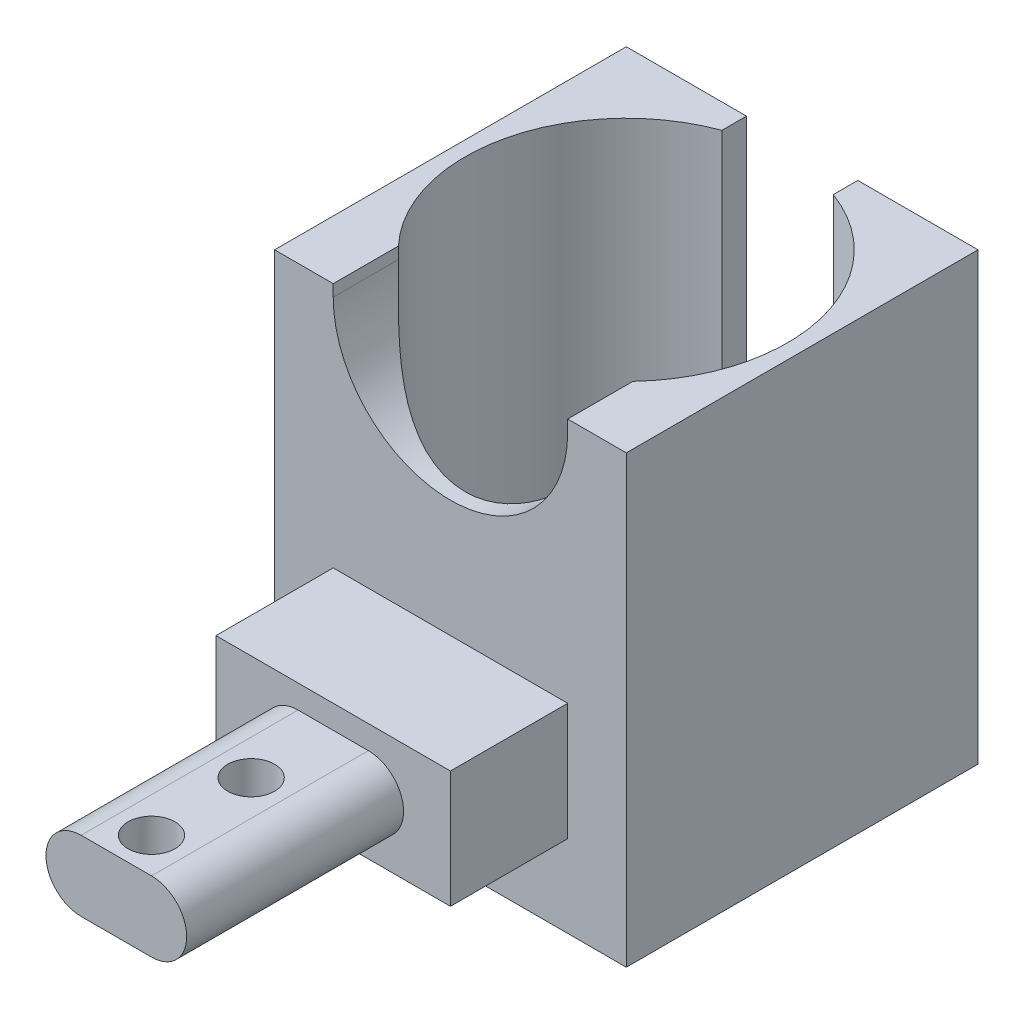
ISO-10303-21;
HEADER;
FILE_DESCRIPTION(('STEP AP214'),'2;1');
FILE_NAME('part.step','',(''),(''),'','','');
FILE_SCHEMA(('AUTOMOTIVE_DESIGN { 1 0 10303 214 1 1 1 1 }'));
ENDSEC;
DATA;
#1=APPLICATION_CONTEXT('core data for automotive mechanical design processes');
#2=APPLICATION_PROTOCOL_DEFINITION('international standard','automotive_design',2000,#1);
#3=PRODUCT_CONTEXT('',#1,'mechanical');
#4=PRODUCT('Part','Part','',(#3));
#5=PRODUCT_RELATED_PRODUCT_CATEGORY('part','',(#4));
#6=PRODUCT_DEFINITION_FORMATION('','',#4);
#7=PRODUCT_DEFINITION_CONTEXT('part definition',#1,'design');
#8=PRODUCT_DEFINITION('design','',#6,#7);
#9=PRODUCT_DEFINITION_SHAPE('','',#8);
#10=(LENGTH_UNIT() NAMED_UNIT(*) SI_UNIT(.MILLI.,.METRE.));
#11=(NAMED_UNIT(*) PLANE_ANGLE_UNIT() SI_UNIT($,.RADIAN.));
#12=(NAMED_UNIT(*) SI_UNIT($,.STERADIAN.) SOLID_ANGLE_UNIT());
#13=UNCERTAINTY_MEASURE_WITH_UNIT(LENGTH_MEASURE(1.E-05),#10,'distance_accuracy_value','');
#14=(GEOMETRIC_REPRESENTATION_CONTEXT(3) GLOBAL_UNCERTAINTY_ASSIGNED_CONTEXT((#13)) GLOBAL_UNIT_ASSIGNED_CONTEXT((#10,
#11,#12)) REPRESENTATION_CONTEXT('',''));
#15=CARTESIAN_POINT('',(0.,0.,0.));
#16=DIRECTION('',(0.,0.,1.));
#17=DIRECTION('',(1.,0.,0.));
#18=AXIS2_PLACEMENT_3D('',#15,#16,#17);
#19=CARTESIAN_POINT('',(-15.,18.,30.));
#20=DIRECTION('',(0.,-1.,0.));
#21=DIRECTION('',(0.,0.,-1.));
#22=AXIS2_PLACEMENT_3D('',#19,#20,#21);
#23=PLANE('',#22);
#24=CARTESIAN_POINT('',(0.,18.,15.));
#25=DIRECTION('',(0.,1.,0.));
#26=DIRECTION('',(0.,0.,1.));
#27=AXIS2_PLACEMENT_3D('',#24,#25,#26);
#28=CIRCLE('',#27,13.75);
#29=CARTESIAN_POINT('',(10.,18.,24.4372930440885));
#30=VERTEX_POINT('',#29);
#31=CARTESIAN_POINT('',(4.75,18.,2.09651209943606));
#32=VERTEX_POINT('',#31);
#33=EDGE_CURVE('E324',#30,#32,#28,.T.);
#34=ORIENTED_EDGE('',*,*,#33,.F.);
#35=DIRECTION('',(0.,0.,-1.));
#36=VECTOR('',#35,1.);
#37=CARTESIAN_POINT('',(10.,18.,-0.001000000000001));
#38=LINE('',#37,#36);
#39=CARTESIAN_POINT('',(10.,18.,30.));
#40=VERTEX_POINT('',#39);
#41=EDGE_CURVE('E243',#40,#30,#38,.T.);
#42=ORIENTED_EDGE('',*,*,#41,.F.);
#43=DIRECTION('',(-1.,0.,0.));
#44=VECTOR('',#43,1.);
#45=CARTESIAN_POINT('',(-15.,18.,30.));
#46=LINE('',#45,#44);
#47=CARTESIAN_POINT('',(15.,18.,30.));
#48=VERTEX_POINT('',#47);
#49=EDGE_CURVE('E289',#48,#40,#46,.T.);
#50=ORIENTED_EDGE('',*,*,#49,.F.);
#51=DIRECTION('',(0.,0.,-1.));
#52=VECTOR('',#51,1.);
#53=CARTESIAN_POINT('',(15.,18.,30.));
#54=LINE('',#53,#52);
#55=CARTESIAN_POINT('',(15.,18.,0.));
#56=VERTEX_POINT('',#55);
#57=EDGE_CURVE('E11',#48,#56,#54,.T.);
#58=ORIENTED_EDGE('',*,*,#57,.T.);
#59=DIRECTION('',(-1.,0.,0.));
#60=VECTOR('',#59,1.);
#61=CARTESIAN_POINT('',(-15.,18.,0.));
#62=LINE('',#61,#60);
#63=CARTESIAN_POINT('',(4.75,18.,0.));
#64=VERTEX_POINT('',#63);
#65=EDGE_CURVE('E182',#56,#64,#62,.T.);
#66=ORIENTED_EDGE('',*,*,#65,.T.);
#67=DIRECTION('',(0.,0.,-1.));
#68=VECTOR('',#67,1.);
#69=CARTESIAN_POINT('',(4.75,18.,58.501));
#70=LINE('',#69,#68);
#71=EDGE_CURVE('E678',#32,#64,#70,.T.);
#72=ORIENTED_EDGE('',*,*,#71,.F.);
#73=EDGE_LOOP('',(#34,#42,#50,#58,#66,#72));
#74=FACE_BOUND('',#73,.T.);
#75=ADVANCED_FACE('F34',(#74),#23,.F.);
#76=CARTESIAN_POINT('',(0.,0.,30.));
#77=DIRECTION('',(0.,0.,1.));
#78=DIRECTION('',(1.,0.,0.));
#79=AXIS2_PLACEMENT_3D('',#76,#77,#78);
#80=PLANE('',#79);
#81=DIRECTION('',(0.,1.,0.));
#82=VECTOR('',#81,1.);
#83=CARTESIAN_POINT('',(10.,17.,30.));
#84=LINE('',#83,#82);
#85=CARTESIAN_POINT('',(10.,17.,30.));
#86=VERTEX_POINT('',#85);
#87=EDGE_CURVE('E227',#86,#40,#84,.T.);
#88=ORIENTED_EDGE('',*,*,#87,.F.);
#89=CARTESIAN_POINT('',(0.,17.,30.));
#90=DIRECTION('',(0.,0.,1.));
#91=DIRECTION('',(1.,0.,0.));
#92=AXIS2_PLACEMENT_3D('',#89,#90,#91);
#93=CIRCLE('',#92,10.);
#94=CARTESIAN_POINT('',(-10.,17.,30.));
#95=VERTEX_POINT('',#94);
#96=EDGE_CURVE('E230',#95,#86,#93,.T.);
#97=ORIENTED_EDGE('',*,*,#96,.F.);
#98=DIRECTION('',(0.,-1.,0.));
#99=VECTOR('',#98,1.);
#100=CARTESIAN_POINT('',(-10.,17.,30.));
#101=LINE('',#100,#99);
#102=CARTESIAN_POINT('',(-10.,18.,30.));
#103=VERTEX_POINT('',#102);
#104=EDGE_CURVE('E222',#103,#95,#101,.T.);
#105=ORIENTED_EDGE('',*,*,#104,.F.);
#106=CARTESIAN_POINT('',(-15.,18.,30.));
#107=VERTEX_POINT('',#106);
#108=EDGE_CURVE('E285',#103,#107,#46,.T.);
#109=ORIENTED_EDGE('',*,*,#108,.T.);
#110=DIRECTION('',(0.,-1.,0.));
#111=VECTOR('',#110,1.);
#112=CARTESIAN_POINT('',(-15.,18.,30.));
#113=LINE('',#112,#111);
#114=CARTESIAN_POINT('',(-15.,-20.,30.));
#115=VERTEX_POINT('',#114);
#116=EDGE_CURVE('E292',#107,#115,#113,.T.);
#117=ORIENTED_EDGE('',*,*,#116,.T.);
#118=DIRECTION('',(-1.,0.,0.));
#119=VECTOR('',#118,1.);
#120=CARTESIAN_POINT('',(15.,-20.,30.));
#121=LINE('',#120,#119);
#122=CARTESIAN_POINT('',(15.,-20.,30.));
#123=VERTEX_POINT('',#122);
#124=EDGE_CURVE('E197',#123,#115,#121,.T.);
#125=ORIENTED_EDGE('',*,*,#124,.F.);
#126=DIRECTION('',(0.,1.,0.));
#127=VECTOR('',#126,1.);
#128=CARTESIAN_POINT('',(15.,18.,30.));
#129=LINE('',#128,#127);
#130=EDGE_CURVE('E181',#123,#48,#129,.T.);
#131=ORIENTED_EDGE('',*,*,#130,.T.);
#132=ORIENTED_EDGE('',*,*,#49,.T.);
#133=EDGE_LOOP('',(#88,#97,#105,#109,#117,#125,#131,#132));
#134=FACE_BOUND('',#133,.T.);
#135=DIRECTION('',(-1.,0.,0.));
#136=VECTOR('',#135,1.);
#137=CARTESIAN_POINT('',(-10.,-3.,30.));
#138=LINE('',#137,#136);
#139=CARTESIAN_POINT('',(10.,-3.,30.));
#140=VERTEX_POINT('',#139);
#141=CARTESIAN_POINT('',(-10.,-3.,30.));
#142=VERTEX_POINT('',#141);
#143=EDGE_CURVE('E376',#140,#142,#138,.T.);
#144=ORIENTED_EDGE('',*,*,#143,.F.);
#145=DIRECTION('',(0.,1.,0.));
#146=VECTOR('',#145,1.);
#147=CARTESIAN_POINT('',(10.,-3.,30.));
#148=LINE('',#147,#146);
#149=CARTESIAN_POINT('',(10.,-13.,30.));
#150=VERTEX_POINT('',#149);
#151=EDGE_CURVE('E362',#150,#140,#148,.T.);
#152=ORIENTED_EDGE('',*,*,#151,.F.);
#153=DIRECTION('',(1.,0.,0.));
#154=VECTOR('',#153,1.);
#155=CARTESIAN_POINT('',(-10.,-13.,30.));
#156=LINE('',#155,#154);
#157=CARTESIAN_POINT('',(-10.,-13.,30.));
#158=VERTEX_POINT('',#157);
#159=EDGE_CURVE('E367',#158,#150,#156,.T.);
#160=ORIENTED_EDGE('',*,*,#159,.F.);
#161=DIRECTION('',(0.,-1.,0.));
#162=VECTOR('',#161,1.);
#163=CARTESIAN_POINT('',(-10.,-3.,30.));
#164=LINE('',#163,#162);
#165=EDGE_CURVE('E378',#142,#158,#164,.T.);
#166=ORIENTED_EDGE('',*,*,#165,.F.);
#167=EDGE_LOOP('',(#144,#152,#160,#166));
#168=FACE_BOUND('',#167,.T.);
#169=ADVANCED_FACE('F266',(#134,#168),#80,.T.);
#170=CARTESIAN_POINT('',(15.,18.,30.));
#171=DIRECTION('',(-1.,0.,0.));
#172=DIRECTION('',(0.,0.,1.));
#173=AXIS2_PLACEMENT_3D('',#170,#171,#172);
#174=PLANE('',#173);
#175=DIRECTION('',(0.,1.,0.));
#176=VECTOR('',#175,1.);
#177=CARTESIAN_POINT('',(15.,18.,0.));
#178=LINE('',#177,#176);
#179=CARTESIAN_POINT('',(15.,-20.,0.));
#180=VERTEX_POINT('',#179);
#181=EDGE_CURVE('E188',#180,#56,#178,.T.);
#182=ORIENTED_EDGE('',*,*,#181,.T.);
#183=ORIENTED_EDGE('',*,*,#57,.F.);
#184=ORIENTED_EDGE('',*,*,#130,.F.);
#185=DIRECTION('',(0.,0.,1.));
#186=VECTOR('',#185,1.);
#187=CARTESIAN_POINT('',(15.,-20.,30.));
#188=LINE('',#187,#186);
#189=EDGE_CURVE('E192',#180,#123,#188,.T.);
#190=ORIENTED_EDGE('',*,*,#189,.F.);
#191=EDGE_LOOP('',(#182,#183,#184,#190));
#192=FACE_BOUND('',#191,.T.);
#193=ADVANCED_FACE('F36',(#192),#174,.F.);
#194=ORIENTED_EDGE('',*,*,#108,.F.);
#195=DIRECTION('',(0.,0.,1.));
#196=VECTOR('',#195,1.);
#197=CARTESIAN_POINT('',(-10.,18.,-0.001000000000001));
#198=LINE('',#197,#196);
#199=CARTESIAN_POINT('',(-10.,18.,24.4372930440884));
#200=VERTEX_POINT('',#199);
#201=EDGE_CURVE('E215',#200,#103,#198,.T.);
#202=ORIENTED_EDGE('',*,*,#201,.F.);
#203=CARTESIAN_POINT('',(-4.75,18.,2.09651209943606));
#204=VERTEX_POINT('',#203);
#205=EDGE_CURVE('E325',#204,#200,#28,.T.);
#206=ORIENTED_EDGE('',*,*,#205,.F.);
#207=DIRECTION('',(0.,0.,1.));
#208=VECTOR('',#207,1.);
#209=CARTESIAN_POINT('',(-4.75,18.,58.501));
#210=LINE('',#209,#208);
#211=CARTESIAN_POINT('',(-4.75,18.,0.));
#212=VERTEX_POINT('',#211);
#213=EDGE_CURVE('E304',#212,#204,#210,.T.);
#214=ORIENTED_EDGE('',*,*,#213,.F.);
#215=CARTESIAN_POINT('',(-15.,18.,0.));
#216=VERTEX_POINT('',#215);
#217=EDGE_CURVE('E299',#212,#216,#62,.T.);
#218=ORIENTED_EDGE('',*,*,#217,.T.);
#219=DIRECTION('',(0.,0.,-1.));
#220=VECTOR('',#219,1.);
#221=CARTESIAN_POINT('',(-15.,18.,30.));
#222=LINE('',#221,#220);
#223=EDGE_CURVE('E42',#107,#216,#222,.T.);
#224=ORIENTED_EDGE('',*,*,#223,.F.);
#225=EDGE_LOOP('',(#194,#202,#206,#214,#218,#224));
#226=FACE_BOUND('',#225,.T.);
#227=ADVANCED_FACE('F268',(#226),#23,.F.);
#228=CARTESIAN_POINT('',(-15.,18.,30.));
#229=DIRECTION('',(1.,0.,0.));
#230=DIRECTION('',(0.,0.,-1.));
#231=AXIS2_PLACEMENT_3D('',#228,#229,#230);
#232=PLANE('',#231);
#233=DIRECTION('',(0.,-1.,0.));
#234=VECTOR('',#233,1.);
#235=CARTESIAN_POINT('',(-15.,18.,0.));
#236=LINE('',#235,#234);
#237=CARTESIAN_POINT('',(-15.,-20.,0.));
#238=VERTEX_POINT('',#237);
#239=EDGE_CURVE('E172',#216,#238,#236,.T.);
#240=ORIENTED_EDGE('',*,*,#239,.T.);
#241=DIRECTION('',(0.,0.,-1.));
#242=VECTOR('',#241,1.);
#243=CARTESIAN_POINT('',(-15.,-20.,30.));
#244=LINE('',#243,#242);
#245=EDGE_CURVE('E177',#115,#238,#244,.T.);
#246=ORIENTED_EDGE('',*,*,#245,.F.);
#247=ORIENTED_EDGE('',*,*,#116,.F.);
#248=ORIENTED_EDGE('',*,*,#223,.T.);
#249=EDGE_LOOP('',(#240,#246,#247,#248));
#250=FACE_BOUND('',#249,.T.);
#251=ADVANCED_FACE('F174',(#250),#232,.F.);
#252=CARTESIAN_POINT('',(0.,0.,0.));
#253=DIRECTION('',(0.,0.,1.));
#254=DIRECTION('',(1.,0.,0.));
#255=AXIS2_PLACEMENT_3D('',#252,#253,#254);
#256=PLANE('',#255);
#257=ORIENTED_EDGE('',*,*,#217,.F.);
#258=DIRECTION('',(0.,1.,0.));
#259=VECTOR('',#258,1.);
#260=CARTESIAN_POINT('',(-4.75,-2.25,0.));
#261=LINE('',#260,#259);
#262=CARTESIAN_POINT('',(-4.75,-2.25,0.));
#263=VERTEX_POINT('',#262);
#264=EDGE_CURVE('E307',#263,#212,#261,.T.);
#265=ORIENTED_EDGE('',*,*,#264,.F.);
#266=CARTESIAN_POINT('',(0.,-2.25,0.));
#267=DIRECTION('',(0.,0.,-1.));
#268=DIRECTION('',(-1.,0.,0.));
#269=AXIS2_PLACEMENT_3D('',#266,#267,#268);
#270=CIRCLE('',#269,4.75);
#271=CARTESIAN_POINT('',(4.75,-2.25,0.));
#272=VERTEX_POINT('',#271);
#273=EDGE_CURVE('E310',#272,#263,#270,.T.);
#274=ORIENTED_EDGE('',*,*,#273,.F.);
#275=DIRECTION('',(0.,-1.,0.));
#276=VECTOR('',#275,1.);
#277=CARTESIAN_POINT('',(4.75,-2.25,0.));
#278=LINE('',#277,#276);
#279=EDGE_CURVE('E311',#64,#272,#278,.T.);
#280=ORIENTED_EDGE('',*,*,#279,.F.);
#281=ORIENTED_EDGE('',*,*,#65,.F.);
#282=ORIENTED_EDGE('',*,*,#181,.F.);
#283=DIRECTION('',(1.,0.,0.));
#284=VECTOR('',#283,1.);
#285=CARTESIAN_POINT('',(15.,-20.,0.));
#286=LINE('',#285,#284);
#287=EDGE_CURVE('E185',#238,#180,#286,.T.);
#288=ORIENTED_EDGE('',*,*,#287,.F.);
#289=ORIENTED_EDGE('',*,*,#239,.F.);
#290=EDGE_LOOP('',(#257,#265,#274,#280,#281,#282,#288,#289));
#291=FACE_BOUND('',#290,.T.);
#292=ADVANCED_FACE('F186',(#291),#256,.F.);
#293=CARTESIAN_POINT('',(10.,-3.,40.));
#294=DIRECTION('',(-1.,0.,0.));
#295=DIRECTION('',(0.,0.,1.));
#296=AXIS2_PLACEMENT_3D('',#293,#294,#295);
#297=PLANE('',#296);
#298=ORIENTED_EDGE('',*,*,#151,.T.);
#299=DIRECTION('',(0.,0.,-1.));
#300=VECTOR('',#299,1.);
#301=CARTESIAN_POINT('',(10.,-3.,40.));
#302=LINE('',#301,#300);
#303=CARTESIAN_POINT('',(10.,-3.,40.));
#304=VERTEX_POINT('',#303);
#305=EDGE_CURVE('E300',#304,#140,#302,.T.);
#306=ORIENTED_EDGE('',*,*,#305,.F.);
#307=DIRECTION('',(0.,1.,0.));
#308=VECTOR('',#307,1.);
#309=CARTESIAN_POINT('',(10.,-3.,40.));
#310=LINE('',#309,#308);
#311=CARTESIAN_POINT('',(10.,-13.,40.));
#312=VERTEX_POINT('',#311);
#313=EDGE_CURVE('E363',#312,#304,#310,.T.);
#314=ORIENTED_EDGE('',*,*,#313,.F.);
#315=DIRECTION('',(0.,0.,-1.));
#316=VECTOR('',#315,1.);
#317=CARTESIAN_POINT('',(10.,-13.,40.));
#318=LINE('',#317,#316);
#319=EDGE_CURVE('E373',#312,#150,#318,.T.);
#320=ORIENTED_EDGE('',*,*,#319,.T.);
#321=EDGE_LOOP('',(#298,#306,#314,#320));
#322=FACE_BOUND('',#321,.T.);
#323=ADVANCED_FACE('F396',(#322),#297,.F.);
#324=CARTESIAN_POINT('',(-10.,-3.,40.));
#325=DIRECTION('',(0.,-1.,0.));
#326=DIRECTION('',(0.,0.,-1.));
#327=AXIS2_PLACEMENT_3D('',#324,#325,#326);
#328=PLANE('',#327);
#329=ORIENTED_EDGE('',*,*,#143,.T.);
#330=DIRECTION('',(0.,0.,-1.));
#331=VECTOR('',#330,1.);
#332=CARTESIAN_POINT('',(-10.,-3.,40.));
#333=LINE('',#332,#331);
#334=CARTESIAN_POINT('',(-10.,-3.,40.));
#335=VERTEX_POINT('',#334);
#336=EDGE_CURVE('E386',#335,#142,#333,.T.);
#337=ORIENTED_EDGE('',*,*,#336,.F.);
#338=DIRECTION('',(-1.,0.,0.));
#339=VECTOR('',#338,1.);
#340=CARTESIAN_POINT('',(-10.,-3.,40.));
#341=LINE('',#340,#339);
#342=EDGE_CURVE('E366',#304,#335,#341,.T.);
#343=ORIENTED_EDGE('',*,*,#342,.F.);
#344=ORIENTED_EDGE('',*,*,#305,.T.);
#345=EDGE_LOOP('',(#329,#337,#343,#344));
#346=FACE_BOUND('',#345,.T.);
#347=ADVANCED_FACE('F390',(#346),#328,.F.);
#348=CARTESIAN_POINT('',(-10.,-3.,40.));
#349=DIRECTION('',(1.,0.,0.));
#350=DIRECTION('',(0.,0.,-1.));
#351=AXIS2_PLACEMENT_3D('',#348,#349,#350);
#352=PLANE('',#351);
#353=ORIENTED_EDGE('',*,*,#165,.T.);
#354=DIRECTION('',(0.,0.,-1.));
#355=VECTOR('',#354,1.);
#356=CARTESIAN_POINT('',(-10.,-13.,40.));
#357=LINE('',#356,#355);
#358=CARTESIAN_POINT('',(-10.,-13.,40.));
#359=VERTEX_POINT('',#358);
#360=EDGE_CURVE('E384',#359,#158,#357,.T.);
#361=ORIENTED_EDGE('',*,*,#360,.F.);
#362=DIRECTION('',(0.,-1.,0.));
#363=VECTOR('',#362,1.);
#364=CARTESIAN_POINT('',(-10.,-3.,40.));
#365=LINE('',#364,#363);
#366=EDGE_CURVE('E369',#335,#359,#365,.T.);
#367=ORIENTED_EDGE('',*,*,#366,.F.);
#368=ORIENTED_EDGE('',*,*,#336,.T.);
#369=EDGE_LOOP('',(#353,#361,#367,#368));
#370=FACE_BOUND('',#369,.T.);
#371=ADVANCED_FACE('F403',(#370),#352,.F.);
#372=CARTESIAN_POINT('',(-10.,-13.,40.));
#373=DIRECTION('',(0.,1.,0.));
#374=DIRECTION('',(0.,0.,1.));
#375=AXIS2_PLACEMENT_3D('',#372,#373,#374);
#376=PLANE('',#375);
#377=ORIENTED_EDGE('',*,*,#159,.T.);
#378=ORIENTED_EDGE('',*,*,#319,.F.);
#379=DIRECTION('',(1.,0.,0.));
#380=VECTOR('',#379,1.);
#381=CARTESIAN_POINT('',(-10.,-13.,40.));
#382=LINE('',#381,#380);
#383=EDGE_CURVE('E371',#359,#312,#382,.T.);
#384=ORIENTED_EDGE('',*,*,#383,.F.);
#385=ORIENTED_EDGE('',*,*,#360,.T.);
#386=EDGE_LOOP('',(#377,#378,#384,#385));
#387=FACE_BOUND('',#386,.T.);
#388=ADVANCED_FACE('F409',(#387),#376,.F.);
#389=CARTESIAN_POINT('',(0.,0.,40.));
#390=DIRECTION('',(0.,0.,1.));
#391=DIRECTION('',(1.,0.,0.));
#392=AXIS2_PLACEMENT_3D('',#389,#390,#391);
#393=PLANE('',#392);
#394=CARTESIAN_POINT('',(-3.,-8.,40.));
#395=DIRECTION('',(0.,0.,1.));
#396=DIRECTION('',(1.,0.,0.));
#397=AXIS2_PLACEMENT_3D('',#394,#395,#396);
#398=CIRCLE('',#397,3.);
#399=CARTESIAN_POINT('',(-3.,-5.,40.));
#400=VERTEX_POINT('',#399);
#401=CARTESIAN_POINT('',(-3.,-11.,40.));
#402=VERTEX_POINT('',#401);
#403=EDGE_CURVE('E327',#400,#402,#398,.T.);
#404=ORIENTED_EDGE('',*,*,#403,.F.);
#405=DIRECTION('',(-1.,0.,0.));
#406=VECTOR('',#405,1.);
#407=CARTESIAN_POINT('',(-3.,-5.,40.));
#408=LINE('',#407,#406);
#409=CARTESIAN_POINT('',(3.,-5.,40.));
#410=VERTEX_POINT('',#409);
#411=EDGE_CURVE('E334',#410,#400,#408,.T.);
#412=ORIENTED_EDGE('',*,*,#411,.F.);
#413=CARTESIAN_POINT('',(3.,-8.,40.));
#414=DIRECTION('',(0.,0.,1.));
#415=DIRECTION('',(1.,0.,0.));
#416=AXIS2_PLACEMENT_3D('',#413,#414,#415);
#417=CIRCLE('',#416,3.);
#418=CARTESIAN_POINT('',(3.,-11.,40.));
#419=VERTEX_POINT('',#418);
#420=EDGE_CURVE('E346',#419,#410,#417,.T.);
#421=ORIENTED_EDGE('',*,*,#420,.F.);
#422=DIRECTION('',(1.,0.,0.));
#423=VECTOR('',#422,1.);
#424=CARTESIAN_POINT('',(-3.,-11.,40.));
#425=LINE('',#424,#423);
#426=EDGE_CURVE('E343',#402,#419,#425,.T.);
#427=ORIENTED_EDGE('',*,*,#426,.F.);
#428=EDGE_LOOP('',(#404,#412,#421,#427));
#429=FACE_BOUND('',#428,.T.);
#430=ORIENTED_EDGE('',*,*,#313,.T.);
#431=ORIENTED_EDGE('',*,*,#342,.T.);
#432=ORIENTED_EDGE('',*,*,#366,.T.);
#433=ORIENTED_EDGE('',*,*,#383,.T.);
#434=EDGE_LOOP('',(#430,#431,#432,#433));
#435=FACE_BOUND('',#434,.T.);
#436=ADVANCED_FACE('F407',(#429,#435),#393,.T.);
#437=CARTESIAN_POINT('',(-3.,-8.,58.5));
#438=DIRECTION('',(0.,0.,-1.));
#439=DIRECTION('',(-1.,0.,0.));
#440=AXIS2_PLACEMENT_3D('',#437,#438,#439);
#441=CYLINDRICAL_SURFACE('',#440,3.);
#442=ORIENTED_EDGE('',*,*,#403,.T.);
#443=DIRECTION('',(0.,0.,-1.));
#444=VECTOR('',#443,1.);
#445=CARTESIAN_POINT('',(-3.,-11.,58.5));
#446=LINE('',#445,#444);
#447=CARTESIAN_POINT('',(-3.,-11.,58.5));
#448=VERTEX_POINT('',#447);
#449=EDGE_CURVE('E359',#448,#402,#446,.T.);
#450=ORIENTED_EDGE('',*,*,#449,.F.);
#451=CARTESIAN_POINT('',(-3.,-8.,58.5));
#452=DIRECTION('',(0.,0.,1.));
#453=DIRECTION('',(1.,0.,0.));
#454=AXIS2_PLACEMENT_3D('',#451,#452,#453);
#455=CIRCLE('',#454,3.);
#456=CARTESIAN_POINT('',(-3.,-5.,58.5));
#457=VERTEX_POINT('',#456);
#458=EDGE_CURVE('E330',#457,#448,#455,.T.);
#459=ORIENTED_EDGE('',*,*,#458,.F.);
#460=DIRECTION('',(0.,0.,-1.));
#461=VECTOR('',#460,1.);
#462=CARTESIAN_POINT('',(-3.,-5.,58.5));
#463=LINE('',#462,#461);
#464=EDGE_CURVE('E340',#457,#400,#463,.T.);
#465=ORIENTED_EDGE('',*,*,#464,.T.);
#466=EDGE_LOOP('',(#442,#450,#459,#465));
#467=FACE_BOUND('',#466,.T.);
#468=ADVANCED_FACE('F416',(#467),#441,.T.);
#469=CARTESIAN_POINT('',(-3.,-11.,58.5));
#470=DIRECTION('',(0.,1.,0.));
#471=DIRECTION('',(0.,0.,1.));
#472=AXIS2_PLACEMENT_3D('',#469,#470,#471);
#473=PLANE('',#472);
#474=CARTESIAN_POINT('',(0.,-11.,55.5));
#475=DIRECTION('',(0.,1.,0.));
#476=DIRECTION('',(0.,0.,1.));
#477=AXIS2_PLACEMENT_3D('',#474,#475,#476);
#478=CIRCLE('',#477,2.);
#479=CARTESIAN_POINT('',(0.,-11.,57.5));
#480=VERTEX_POINT('',#479);
#481=EDGE_CURVE('E211',#480,#480,#478,.F.);
#482=ORIENTED_EDGE('',*,*,#481,.F.);
#483=EDGE_LOOP('',(#482));
#484=FACE_BOUND('',#483,.T.);
#485=CARTESIAN_POINT('',(0.,-11.,47.));
#486=DIRECTION('',(0.,1.,0.));
#487=DIRECTION('',(0.,0.,1.));
#488=AXIS2_PLACEMENT_3D('',#485,#486,#487);
#489=CIRCLE('',#488,2.);
#490=CARTESIAN_POINT('',(0.,-11.,49.));
#491=VERTEX_POINT('',#490);
#492=EDGE_CURVE('E212',#491,#491,#489,.F.);
#493=ORIENTED_EDGE('',*,*,#492,.F.);
#494=EDGE_LOOP('',(#493));
#495=FACE_BOUND('',#494,.T.);
#496=ORIENTED_EDGE('',*,*,#426,.T.);
#497=DIRECTION('',(0.,0.,-1.));
#498=VECTOR('',#497,1.);
#499=CARTESIAN_POINT('',(3.,-11.,58.5));
#500=LINE('',#499,#498);
#501=CARTESIAN_POINT('',(3.,-11.,58.5));
#502=VERTEX_POINT('',#501);
#503=EDGE_CURVE('E356',#502,#419,#500,.T.);
#504=ORIENTED_EDGE('',*,*,#503,.F.);
#505=DIRECTION('',(1.,0.,0.));
#506=VECTOR('',#505,1.);
#507=CARTESIAN_POINT('',(-3.,-11.,58.5));
#508=LINE('',#507,#506);
#509=EDGE_CURVE('E333',#448,#502,#508,.T.);
#510=ORIENTED_EDGE('',*,*,#509,.F.);
#511=ORIENTED_EDGE('',*,*,#449,.T.);
#512=EDGE_LOOP('',(#496,#504,#510,#511));
#513=FACE_BOUND('',#512,.T.);
#514=ADVANCED_FACE('F463',(#484,#495,#513),#473,.F.);
#515=CARTESIAN_POINT('',(3.,-8.,58.5));
#516=DIRECTION('',(0.,0.,-1.));
#517=DIRECTION('',(-1.,0.,0.));
#518=AXIS2_PLACEMENT_3D('',#515,#516,#517);
#519=CYLINDRICAL_SURFACE('',#518,3.);
#520=ORIENTED_EDGE('',*,*,#420,.T.);
#521=DIRECTION('',(0.,0.,-1.));
#522=VECTOR('',#521,1.);
#523=CARTESIAN_POINT('',(3.,-5.,58.5));
#524=LINE('',#523,#522);
#525=CARTESIAN_POINT('',(3.,-5.,58.5));
#526=VERTEX_POINT('',#525);
#527=EDGE_CURVE('E353',#526,#410,#524,.T.);
#528=ORIENTED_EDGE('',*,*,#527,.F.);
#529=CARTESIAN_POINT('',(3.,-8.,58.5));
#530=DIRECTION('',(0.,0.,1.));
#531=DIRECTION('',(1.,0.,0.));
#532=AXIS2_PLACEMENT_3D('',#529,#530,#531);
#533=CIRCLE('',#532,3.);
#534=EDGE_CURVE('E336',#502,#526,#533,.T.);
#535=ORIENTED_EDGE('',*,*,#534,.F.);
#536=ORIENTED_EDGE('',*,*,#503,.T.);
#537=EDGE_LOOP('',(#520,#528,#535,#536));
#538=FACE_BOUND('',#537,.T.);
#539=ADVANCED_FACE('F470',(#538),#519,.T.);
#540=CARTESIAN_POINT('',(-3.,-5.,58.5));
#541=DIRECTION('',(0.,-1.,0.));
#542=DIRECTION('',(0.,0.,-1.));
#543=AXIS2_PLACEMENT_3D('',#540,#541,#542);
#544=PLANE('',#543);
#545=CARTESIAN_POINT('',(0.,-5.,55.5));
#546=DIRECTION('',(0.,-1.,0.));
#547=DIRECTION('',(0.,0.,-1.));
#548=AXIS2_PLACEMENT_3D('',#545,#546,#547);
#549=CIRCLE('',#548,2.);
#550=CARTESIAN_POINT('',(0.,-5.,53.5));
#551=VERTEX_POINT('',#550);
#552=EDGE_CURVE('E208',#551,#551,#549,.F.);
#553=ORIENTED_EDGE('',*,*,#552,.F.);
#554=EDGE_LOOP('',(#553));
#555=FACE_BOUND('',#554,.T.);
#556=CARTESIAN_POINT('',(0.,-5.,47.));
#557=DIRECTION('',(0.,-1.,0.));
#558=DIRECTION('',(0.,0.,-1.));
#559=AXIS2_PLACEMENT_3D('',#556,#557,#558);
#560=CIRCLE('',#559,2.);
#561=CARTESIAN_POINT('',(0.,-5.,45.));
#562=VERTEX_POINT('',#561);
#563=EDGE_CURVE('E216',#562,#562,#560,.F.);
#564=ORIENTED_EDGE('',*,*,#563,.F.);
#565=EDGE_LOOP('',(#564));
#566=FACE_BOUND('',#565,.T.);
#567=ORIENTED_EDGE('',*,*,#411,.T.);
#568=ORIENTED_EDGE('',*,*,#464,.F.);
#569=DIRECTION('',(-1.,0.,0.));
#570=VECTOR('',#569,1.);
#571=CARTESIAN_POINT('',(-3.,-5.,58.5));
#572=LINE('',#571,#570);
#573=EDGE_CURVE('E338',#526,#457,#572,.T.);
#574=ORIENTED_EDGE('',*,*,#573,.F.);
#575=ORIENTED_EDGE('',*,*,#527,.T.);
#576=EDGE_LOOP('',(#567,#568,#574,#575));
#577=FACE_BOUND('',#576,.T.);
#578=ADVANCED_FACE('F475',(#555,#566,#577),#544,.F.);
#579=CARTESIAN_POINT('',(-3.,-8.,58.5));
#580=DIRECTION('',(0.,0.,1.));
#581=DIRECTION('',(1.,0.,0.));
#582=AXIS2_PLACEMENT_3D('',#579,#580,#581);
#583=PLANE('',#582);
#584=ORIENTED_EDGE('',*,*,#458,.T.);
#585=ORIENTED_EDGE('',*,*,#509,.T.);
#586=ORIENTED_EDGE('',*,*,#534,.T.);
#587=ORIENTED_EDGE('',*,*,#573,.T.);
#588=EDGE_LOOP('',(#584,#585,#586,#587));
#589=FACE_BOUND('',#588,.T.);
#590=ADVANCED_FACE('F483',(#589),#583,.T.);
#591=CARTESIAN_POINT('',(0.,-18.001,15.));
#592=DIRECTION('',(0.,1.,0.));
#593=DIRECTION('',(0.,0.,1.));
#594=AXIS2_PLACEMENT_3D('',#591,#592,#593);
#595=CYLINDRICAL_SURFACE('',#594,13.75);
#596=CARTESIAN_POINT('',(10.,17.,24.4372930440884));
#597=CARTESIAN_POINT('',(10.0000024980503,16.8807104753301,24.4372854084685));
#598=CARTESIAN_POINT('',(9.99786481288267,16.7614433877258,24.4395560823076));
#599=CARTESIAN_POINT('',(9.98933942516417,16.5232477639236,24.4485795261707));
#600=CARTESIAN_POINT('',(9.98295233322883,16.4043191815498,24.4553316522353));
#601=CARTESIAN_POINT('',(9.9574971485713,16.0489274107124,24.4821619087198));
#602=CARTESIAN_POINT('',(9.93213486861746,15.8133559078025,24.5088145459792));
#603=CARTESIAN_POINT('',(9.8656509901607,15.3498004963584,24.5777691261876));
#604=CARTESIAN_POINT('',(9.8247210450719,15.1217595913011,24.6198805446958));
#605=CARTESIAN_POINT('',(9.72792238503258,14.6718007135422,24.7177546490846));
#606=CARTESIAN_POINT('',(9.67204746142587,14.4498853279573,24.7735230077112));
#607=CARTESIAN_POINT('',(9.5467280193529,14.0148936750836,24.8959627448416));
#608=CARTESIAN_POINT('',(9.47738357837424,13.8017654747758,24.9625531541589));
#609=CARTESIAN_POINT('',(9.32573478041336,13.383343478004,25.1046524312799));
#610=CARTESIAN_POINT('',(9.24343149077002,13.178049038051,25.1801605644588));
#611=CARTESIAN_POINT('',(8.97752768715438,12.5729762325034,25.4174264062351));
#612=CARTESIAN_POINT('',(8.77529210658858,12.185230973332,25.5895587032683));
#613=CARTESIAN_POINT('',(8.4166641873151,11.5938465290047,25.8743601007994));
#614=CARTESIAN_POINT('',(8.27475557895289,11.3791106736103,25.9829600816201));
#615=CARTESIAN_POINT('',(7.97534989004384,10.9618125086179,26.2022618519787));
#616=CARTESIAN_POINT('',(7.81785162405319,10.7592511266568,26.3129638008329));
#617=CARTESIAN_POINT('',(7.48762527624939,10.3666517444627,26.5341886888993));
#618=CARTESIAN_POINT('',(7.31488924801362,10.1766203699154,26.6447115037333));
#619=CARTESIAN_POINT('',(6.95457901273731,9.80973358216839,26.8634206116921));
#620=CARTESIAN_POINT('',(6.76700488309034,9.63287810025428,26.971606917));
#621=CARTESIAN_POINT('',(6.3408513185434,9.26128054996038,27.2035005523841));
#622=CARTESIAN_POINT('',(6.0992944854959,9.06938146004105,27.3263254360047));
#623=CARTESIAN_POINT('',(5.5963538389397,8.70681472377258,27.562664303929));
#624=CARTESIAN_POINT('',(5.33496595522406,8.53615145503097,27.6761763668261));
#625=CARTESIAN_POINT('',(4.79391570133118,8.21839242831576,27.8905159616341));
#626=CARTESIAN_POINT('',(4.51428373285663,8.07125880522172,27.9913638161047));
#627=CARTESIAN_POINT('',(3.93809079660034,7.80258978528394,28.1774604778057));
#628=CARTESIAN_POINT('',(3.64153811921496,7.68104198710926,28.2627168395188));
#629=CARTESIAN_POINT('',(3.1211315551365,7.49676886857461,28.392945054157));
#630=CARTESIAN_POINT('',(2.90081938263626,7.42717097284326,28.4424578943559));
#631=CARTESIAN_POINT('',(2.45398583132679,7.30300647644233,28.5311599782836));
#632=CARTESIAN_POINT('',(2.22746587499287,7.24843646337274,28.5703515655836));
#633=CARTESIAN_POINT('',(1.76972397108652,7.15507218319869,28.6375971511265));
#634=CARTESIAN_POINT('',(1.53850526240836,7.11626741201902,28.6656585648918));
#635=CARTESIAN_POINT('',(1.07278741366012,7.05493659428605,28.7100816179697));
#636=CARTESIAN_POINT('',(0.838288159068381,7.03241111748481,28.7264428477924));
#637=CARTESIAN_POINT('',(0.367205614686332,7.00395231370901,28.7471223567583));
#638=CARTESIAN_POINT('',(0.130618758085628,6.99805750161261,28.7514126808851));
#639=CARTESIAN_POINT('',(-0.342281314748853,7.00306255569793,28.7477727427253));
#640=CARTESIAN_POINT('',(-0.578594532028685,7.01396235746444,28.7398425273102));
#641=CARTESIAN_POINT('',(-1.04919336217353,7.0523900439322,28.7119389558017));
#642=CARTESIAN_POINT('',(-1.2834785213941,7.07992155612815,28.691962972442));
#643=CARTESIAN_POINT('',(-1.74826326896675,7.15120033416073,28.6404087087103));
#644=CARTESIAN_POINT('',(-1.97876286898499,7.19494755001473,28.6088304641006));
#645=CARTESIAN_POINT('',(-2.42777027142393,7.29652836981198,28.5358285050781));
#646=CARTESIAN_POINT('',(-2.64643163321175,7.35391258652005,28.494719739986));
#647=CARTESIAN_POINT('',(-3.07760641009372,7.48270074806928,28.4029639611865));
#648=CARTESIAN_POINT('',(-3.2901176479174,7.55410958990843,28.3523136160851));
#649=CARTESIAN_POINT('',(-3.70785250701343,7.71013812419118,28.2423928818454));
#650=CARTESIAN_POINT('',(-3.91307802470339,7.79475434744458,28.1831247566232));
#651=CARTESIAN_POINT('',(-4.31557012577348,7.97644016158242,28.0569085823032));
#652=CARTESIAN_POINT('',(-4.51283379055185,8.0735142656588,27.9899577508798));
#653=CARTESIAN_POINT('',(-4.91997842680926,8.29065193127475,27.8416617176264));
#654=CARTESIAN_POINT('',(-5.12885532081621,8.4120700036503,27.759543297256));
#655=CARTESIAN_POINT('',(-5.53540193968699,8.66830774577516,27.5885062746511));
#656=CARTESIAN_POINT('',(-5.73306685682181,8.8031330973947,27.4995847930611));
#657=CARTESIAN_POINT('',(-6.11676744072543,9.08533602685275,27.3163662705855));
#658=CARTESIAN_POINT('',(-6.30279659575873,9.23272052610483,27.2220662751618));
#659=CARTESIAN_POINT('',(-6.66279849015676,9.53923481706049,27.0296005556012));
#660=CARTESIAN_POINT('',(-6.83676985899228,9.69836593969431,26.9314343940048));
#661=CARTESIAN_POINT('',(-7.20414042698038,10.0589229840696,26.7139497733869));
#662=CARTESIAN_POINT('',(-7.39499164621965,10.262656214304,26.5941419865309));
#663=CARTESIAN_POINT('',(-7.75888546530369,10.6851405809997,26.3538428595408));
#664=CARTESIAN_POINT('',(-7.93192444791436,10.9038947528736,26.2333513857877));
#665=CARTESIAN_POINT('',(-8.25976680283204,11.356039894756,25.9945395273958));
#666=CARTESIAN_POINT('',(-8.4145587641473,11.5894398853854,25.8762205399787));
#667=CARTESIAN_POINT('',(-8.70505458967552,12.0704035089635,25.6451371922376));
#668=CARTESIAN_POINT('',(-8.84076366616808,12.3179632482428,25.5323713206306));
#669=CARTESIAN_POINT('',(-9.06489894140584,12.7718726258497,25.3395840630736));
#670=CARTESIAN_POINT('',(-9.15720186714037,12.9755461699054,25.2577577212964));
#671=CARTESIAN_POINT('',(-9.32884225800041,13.3912256398969,25.1019125266802));
#672=CARTESIAN_POINT('',(-9.40817974799781,13.6032315498476,25.027893658864));
#673=CARTESIAN_POINT('',(-9.55279445962024,14.0342643895847,24.8902251575756));
#674=CARTESIAN_POINT('',(-9.6181263706591,14.253260026349,24.8265354370289));
#675=CARTESIAN_POINT('',(-9.73420644084548,14.698253587452,24.7115610603724));
#676=CARTESIAN_POINT('',(-9.78496001001655,14.924248879637,24.660271803571));
#677=CARTESIAN_POINT('',(-9.85614905020551,15.3030526286644,24.5875148899715));
#678=CARTESIAN_POINT('',(-9.88100520304164,15.454244675524,24.5618612554207));
#679=CARTESIAN_POINT('',(-9.92383341113861,15.7585762002751,24.5174041257421));
#680=CARTESIAN_POINT('',(-9.94180720335204,15.9117151767118,24.4985989022886));
#681=CARTESIAN_POINT('',(-9.9707674386762,16.2202988166174,24.4681976500469));
#682=CARTESIAN_POINT('',(-9.98171158805674,16.3757517829508,24.4566452670656));
#683=CARTESIAN_POINT('',(-9.99633727874533,16.687464584768,24.4411737438584));
#684=CARTESIAN_POINT('',(-10.0000146607074,16.8437248310533,24.4372589752597));
#685=CARTESIAN_POINT('',(-10.,17.,24.4372930440884));
#686=B_SPLINE_CURVE_WITH_KNOTS('',3,(#596,#597,#598,#599,#600,#601,#602,#603,#604,#605,#606,
#607,#608,#609,#610,#611,#612,#613,#614,#615,#616,#617,#618,#619,#620,#621,#622,#623,#624,#625,
#626,#627,#628,#629,#630,#631,#632,#633,#634,#635,#636,#637,#638,#639,#640,#641,#642,#643,#644,
#645,#646,#647,#648,#649,#650,#651,#652,#653,#654,#655,#656,#657,#658,#659,#660,#661,#662,#663,
#664,#665,#666,#667,#668,#669,#670,#671,#672,#673,#674,#675,#676,#677,#678,#679,#680,#681,#682,
#683,#684,#685),.UNSPECIFIED.,.F.,.F.,(4,2,2,2,2,2,2,2,2,2,2,2,2,2,2,2,2,2,2,2,2,2,2,2,2,2,2,2,
2,2,2,2,2,2,2,2,2,2,2,2,2,2,2,2,4),(0.,0.357784356381236,0.715517312294934,1.42948364210737,
2.13493082398107,2.84067152920455,3.54135644321337,4.24198367637057,5.64718079432778,
6.48472229437738,7.3223275304155,8.16037218559129,8.99841246992638,9.99322376823097,
10.9882398009795,11.9816381296155,12.9745538483127,13.6827114079768,14.3907080325837,
15.098232156065,15.8057810406811,16.514967194629,17.2241506285229,17.9334887962574,
18.6428247775748,19.3314155832199,20.0202472539202,20.7088982923726,21.3977995206213,
22.1625937018559,22.9277133877462,23.6932574965293,24.4588884774555,25.3693130481546,
26.27992214081,27.1910977061599,28.1020239084991,28.8158119348745,29.5295985919577,
30.2405451072343,30.951227448344,31.4170100117907,31.8826749446223,32.3511159304958,
32.8198249646377),.UNSPECIFIED.);
#687=CARTESIAN_POINT('',(10.,17.,24.4372930440884));
#688=VERTEX_POINT('',#687);
#689=CARTESIAN_POINT('',(-10.,17.,24.4372930440885));
#690=VERTEX_POINT('',#689);
#691=EDGE_CURVE('E235',#688,#690,#686,.T.);
#692=ORIENTED_EDGE('',*,*,#691,.F.);
#693=DIRECTION('',(0.,1.,0.));
#694=VECTOR('',#693,1.);
#695=CARTESIAN_POINT('',(9.99999999999994,-18.001,24.4372930440885));
#696=LINE('',#695,#694);
#697=EDGE_CURVE('E49',#30,#688,#696,.F.);
#698=ORIENTED_EDGE('',*,*,#697,.F.);
#699=ORIENTED_EDGE('',*,*,#33,.T.);
#700=DIRECTION('',(0.,1.,0.));
#701=VECTOR('',#700,1.);
#702=CARTESIAN_POINT('',(4.75,-18.001,2.09651209943606));
#703=LINE('',#702,#701);
#704=CARTESIAN_POINT('',(4.75,-2.25,2.09651209943606));
#705=VERTEX_POINT('',#704);
#706=EDGE_CURVE('E316',#705,#32,#703,.T.);
#707=ORIENTED_EDGE('',*,*,#706,.F.);
#708=CARTESIAN_POINT('',(-4.75,-2.25,2.09651209943606));
#709=CARTESIAN_POINT('',(-4.75001861969154,-2.37928940152569,2.0965342944605));
#710=CARTESIAN_POINT('',(-4.74472216946441,-2.50857008500048,2.0945696621049));
#711=CARTESIAN_POINT('',(-4.72363840270953,-2.76612217922171,2.08682952162064));
#712=CARTESIAN_POINT('',(-4.70785410709685,-2.89439386983603,2.08105511086252));
#713=CARTESIAN_POINT('',(-4.6659991148601,-3.14861483172352,2.06588170570032));
#714=CARTESIAN_POINT('',(-4.63996063724162,-3.27457009616077,2.0564940662616));
#715=CARTESIAN_POINT('',(-4.57784993039828,-3.52368322738239,2.0343961776271));
#716=CARTESIAN_POINT('',(-4.54177729829228,-3.64684098162917,2.02168579502116));
#717=CARTESIAN_POINT('',(-4.45994827009554,-3.88942923249216,1.99333899236432));
#718=CARTESIAN_POINT('',(-4.41420053649488,-4.00886295434424,1.97770519120301));
#719=CARTESIAN_POINT('',(-4.31338004337037,-4.24338133925982,1.94396401057369));
#720=CARTESIAN_POINT('',(-4.25830380034708,-4.35846435795215,1.92585570755447));
#721=CARTESIAN_POINT('',(-4.07964089709689,-4.69618046001237,1.86856068670392));
#722=CARTESIAN_POINT('',(-3.94259010915029,-4.91136881261958,1.8263929670416));
#723=CARTESIAN_POINT('',(-3.63056035090872,-5.32426470314603,1.73693887401007));
#724=CARTESIAN_POINT('',(-3.45433860435185,-5.52099796763443,1.68951892327759));
#725=CARTESIAN_POINT('',(-3.07155055194892,-5.88282493797342,1.59601363389289));
#726=CARTESIAN_POINT('',(-2.86497873297718,-6.04791288283169,1.54992853954353));
#727=CARTESIAN_POINT('',(-2.42016539314879,-6.34621824113501,1.46271725719821));
#728=CARTESIAN_POINT('',(-2.18119360171804,-6.47840261626935,1.42176811062936));
#729=CARTESIAN_POINT('',(-1.6827531429999,-6.70030210247306,1.35104114812478));
#730=CARTESIAN_POINT('',(-1.42329115229466,-6.79003098127338,1.32125971130593));
#731=CARTESIAN_POINT('',(-0.901458400054179,-6.92113849576795,1.2771775861229));
#732=CARTESIAN_POINT('',(-0.639553723288159,-6.96418938327701,1.26234292909533));
#733=CARTESIAN_POINT('',(-0.111840511740886,-7.0060485612527,1.2479243195354));
#734=CARTESIAN_POINT('',(0.15396700025707,-7.00486824323801,1.24833644027377));
#735=CARTESIAN_POINT('',(0.670054126477307,-6.95933323370776,1.2640098766339));
#736=CARTESIAN_POINT('',(0.920516424763993,-6.916797773347,1.27864548335785));
#737=CARTESIAN_POINT('',(1.41049748696031,-6.79278278959676,1.32032581053277));
#738=CARTESIAN_POINT('',(1.65001563612125,-6.71130108147925,1.34737122712082));
#739=CARTESIAN_POINT('',(2.11515897782435,-6.51070972722654,1.41160324737221));
#740=CARTESIAN_POINT('',(2.34055046341243,-6.39110261150868,1.4489229814699));
#741=CARTESIAN_POINT('',(2.76858710907458,-6.11806171943481,1.52984993093552));
#742=CARTESIAN_POINT('',(2.97122568070568,-5.96461818316949,1.57345895915378));
#743=CARTESIAN_POINT('',(3.35876652449214,-5.61926237994136,1.66497723251139));
#744=CARTESIAN_POINT('',(3.54226596389148,-5.42580456904022,1.71299244822673));
#745=CARTESIAN_POINT('',(3.87478098463232,-5.01030648975827,1.80611982650965));
#746=CARTESIAN_POINT('',(4.02378485912267,-4.78825655766272,1.85123099978602));
#747=CARTESIAN_POINT('',(4.21919122990019,-4.43619062156647,1.91314795015015));
#748=CARTESIAN_POINT('',(4.28004899687117,-4.31451798704783,1.93297622892346));
#749=CARTESIAN_POINT('',(4.39122672981436,-4.06607182582811,1.96991708713514));
#750=CARTESIAN_POINT('',(4.44155111097223,-3.93930046298689,1.98703080368097));
#751=CARTESIAN_POINT('',(4.53115412484882,-3.68168668198019,2.0179588916047));
#752=CARTESIAN_POINT('',(4.57044497981753,-3.55084894822598,2.0317769111716));
#753=CARTESIAN_POINT('',(4.63765585555814,-3.28600342430026,2.05566090335567));
#754=CARTESIAN_POINT('',(4.66558105033437,-3.15199710603121,2.06572858306767));
#755=CARTESIAN_POINT('',(4.70839560441965,-2.89028570277629,2.08125302020465));
#756=CARTESIAN_POINT('',(4.723990841353,-2.76271049458911,2.08695871091276));
#757=CARTESIAN_POINT('',(4.74479549634035,-2.50676023813525,2.09459661213514));
#758=CARTESIAN_POINT('',(4.75001740964578,-2.37838633923762,2.09653336249253));
#759=CARTESIAN_POINT('',(4.75,-2.25,2.09651209943606));
#760=B_SPLINE_CURVE_WITH_KNOTS('',3,(#708,#709,#710,#711,#712,#713,#714,#715,#716,#717,#718,
#719,#720,#721,#722,#723,#724,#725,#726,#727,#728,#729,#730,#731,#732,#733,#734,#735,#736,#737,
#738,#739,#740,#741,#742,#743,#744,#745,#746,#747,#748,#749,#750,#751,#752,#753,#754,#755,#756,
#757,#758,#759),.UNSPECIFIED.,.F.,.F.,(4,2,2,2,2,2,2,2,2,2,2,2,2,2,2,2,2,2,2,2,2,2,2,2,2,4),(0.,
0.387731212336713,0.775350791105968,1.16176204997327,1.54818882587167,1.93427107276811,
2.32049781161254,3.09267320789542,3.89417461832535,4.69582180283365,5.52013391264494,
6.34417852590655,7.13761231084461,7.93084175241145,8.69068543597969,9.45057174872936,
10.2208096935064,10.9912701000142,11.8004442946935,12.6098926997125,13.0219018832883,
13.4337380212571,13.8451161369472,14.2563067704113,14.6417884812677,15.0268055754924),.UNSPECIFIED.);
#761=CARTESIAN_POINT('',(-4.75,-2.25,2.09651209943606));
#762=VERTEX_POINT('',#761);
#763=EDGE_CURVE('E671',#762,#705,#760,.T.);
#764=ORIENTED_EDGE('',*,*,#763,.F.);
#765=DIRECTION('',(0.,1.,0.));
#766=VECTOR('',#765,1.);
#767=CARTESIAN_POINT('',(-4.75,-18.001,2.09651209943606));
#768=LINE('',#767,#766);
#769=EDGE_CURVE('E57',#204,#762,#768,.F.);
#770=ORIENTED_EDGE('',*,*,#769,.F.);
#771=ORIENTED_EDGE('',*,*,#205,.T.);
#772=DIRECTION('',(0.,1.,0.));
#773=VECTOR('',#772,1.);
#774=CARTESIAN_POINT('',(-9.99999999999994,-18.001,24.4372930440885));
#775=LINE('',#774,#773);
#776=EDGE_CURVE('E223',#690,#200,#775,.T.);
#777=ORIENTED_EDGE('',*,*,#776,.F.);
#778=EDGE_LOOP('',(#692,#698,#699,#707,#764,#770,#771,#777));
#779=FACE_BOUND('',#778,.T.);
#780=CARTESIAN_POINT('',(0.,-18.,15.));
#781=DIRECTION('',(0.,1.,0.));
#782=DIRECTION('',(0.,0.,1.));
#783=AXIS2_PLACEMENT_3D('',#780,#781,#782);
#784=CIRCLE('',#783,13.75);
#785=CARTESIAN_POINT('',(0.,-18.,28.75));
#786=VERTEX_POINT('',#785);
#787=EDGE_CURVE('E207',#786,#786,#784,.F.);
#788=ORIENTED_EDGE('',*,*,#787,.T.);
#789=EDGE_LOOP('',(#788));
#790=FACE_BOUND('',#789,.T.);
#791=ADVANCED_FACE('F488',(#779,#790),#595,.F.);
#792=CARTESIAN_POINT('',(-4.75,-2.25,58.501));
#793=DIRECTION('',(-1.,0.,0.));
#794=DIRECTION('',(0.,0.,1.));
#795=AXIS2_PLACEMENT_3D('',#792,#793,#794);
#796=PLANE('',#795);
#797=ORIENTED_EDGE('',*,*,#769,.T.);
#798=DIRECTION('',(0.,0.,-1.));
#799=VECTOR('',#798,1.);
#800=CARTESIAN_POINT('',(-4.75,-2.25,58.501));
#801=LINE('',#800,#799);
#802=EDGE_CURVE('E314',#762,#263,#801,.T.);
#803=ORIENTED_EDGE('',*,*,#802,.T.);
#804=ORIENTED_EDGE('',*,*,#264,.T.);
#805=ORIENTED_EDGE('',*,*,#213,.T.);
#806=EDGE_LOOP('',(#797,#803,#804,#805));
#807=FACE_BOUND('',#806,.T.);
#808=ADVANCED_FACE('F496',(#807),#796,.F.);
#809=CARTESIAN_POINT('',(4.75,-2.25,58.501));
#810=DIRECTION('',(1.,0.,0.));
#811=DIRECTION('',(0.,0.,-1.));
#812=AXIS2_PLACEMENT_3D('',#809,#810,#811);
#813=PLANE('',#812);
#814=ORIENTED_EDGE('',*,*,#706,.T.);
#815=ORIENTED_EDGE('',*,*,#71,.T.);
#816=ORIENTED_EDGE('',*,*,#279,.T.);
#817=DIRECTION('',(0.,0.,-1.));
#818=VECTOR('',#817,1.);
#819=CARTESIAN_POINT('',(4.75,-2.25,58.501));
#820=LINE('',#819,#818);
#821=EDGE_CURVE('E320',#705,#272,#820,.T.);
#822=ORIENTED_EDGE('',*,*,#821,.F.);
#823=EDGE_LOOP('',(#814,#815,#816,#822));
#824=FACE_BOUND('',#823,.T.);
#825=ADVANCED_FACE('F262',(#824),#813,.F.);
#826=CARTESIAN_POINT('',(0.,-2.25,58.501));
#827=DIRECTION('',(0.,0.,-1.));
#828=DIRECTION('',(-1.,0.,0.));
#829=AXIS2_PLACEMENT_3D('',#826,#827,#828);
#830=CYLINDRICAL_SURFACE('',#829,4.75);
#831=ORIENTED_EDGE('',*,*,#763,.T.);
#832=ORIENTED_EDGE('',*,*,#821,.T.);
#833=ORIENTED_EDGE('',*,*,#273,.T.);
#834=ORIENTED_EDGE('',*,*,#802,.F.);
#835=EDGE_LOOP('',(#831,#832,#833,#834));
#836=FACE_BOUND('',#835,.T.);
#837=ADVANCED_FACE('F256',(#836),#830,.F.);
#838=CARTESIAN_POINT('',(10.,17.,-0.001000000000001));
#839=DIRECTION('',(1.,0.,0.));
#840=DIRECTION('',(0.,1.,0.));
#841=AXIS2_PLACEMENT_3D('',#838,#839,#840);
#842=PLANE('',#841);
#843=ORIENTED_EDGE('',*,*,#697,.T.);
#844=DIRECTION('',(0.,0.,1.));
#845=VECTOR('',#844,1.);
#846=CARTESIAN_POINT('',(10.,17.,-0.001000000000001));
#847=LINE('',#846,#845);
#848=EDGE_CURVE('E226',#688,#86,#847,.T.);
#849=ORIENTED_EDGE('',*,*,#848,.T.);
#850=ORIENTED_EDGE('',*,*,#87,.T.);
#851=ORIENTED_EDGE('',*,*,#41,.T.);
#852=EDGE_LOOP('',(#843,#849,#850,#851));
#853=FACE_BOUND('',#852,.T.);
#854=ADVANCED_FACE('F253',(#853),#842,.F.);
#855=CARTESIAN_POINT('',(-10.,17.,-0.001000000000001));
#856=DIRECTION('',(-1.,0.,0.));
#857=DIRECTION('',(0.,-1.,0.));
#858=AXIS2_PLACEMENT_3D('',#855,#856,#857);
#859=PLANE('',#858);
#860=ORIENTED_EDGE('',*,*,#776,.T.);
#861=ORIENTED_EDGE('',*,*,#201,.T.);
#862=ORIENTED_EDGE('',*,*,#104,.T.);
#863=DIRECTION('',(0.,0.,1.));
#864=VECTOR('',#863,1.);
#865=CARTESIAN_POINT('',(-10.,17.,-0.001000000000001));
#866=LINE('',#865,#864);
#867=EDGE_CURVE('E224',#690,#95,#866,.T.);
#868=ORIENTED_EDGE('',*,*,#867,.F.);
#869=EDGE_LOOP('',(#860,#861,#862,#868));
#870=FACE_BOUND('',#869,.T.);
#871=ADVANCED_FACE('F255',(#870),#859,.F.);
#872=CARTESIAN_POINT('',(0.,17.,-0.001000000000001));
#873=DIRECTION('',(0.,0.,1.));
#874=DIRECTION('',(1.,0.,0.));
#875=AXIS2_PLACEMENT_3D('',#872,#873,#874);
#876=CYLINDRICAL_SURFACE('',#875,10.);
#877=ORIENTED_EDGE('',*,*,#691,.T.);
#878=ORIENTED_EDGE('',*,*,#867,.T.);
#879=ORIENTED_EDGE('',*,*,#96,.T.);
#880=ORIENTED_EDGE('',*,*,#848,.F.);
#881=EDGE_LOOP('',(#877,#878,#879,#880));
#882=FACE_BOUND('',#881,.T.);
#883=ADVANCED_FACE('F245',(#882),#876,.F.);
#884=CARTESIAN_POINT('',(0.,18.001,47.));
#885=DIRECTION('',(0.,-1.,0.));
#886=DIRECTION('',(0.,0.,-1.));
#887=AXIS2_PLACEMENT_3D('',#884,#885,#886);
#888=CYLINDRICAL_SURFACE('',#887,2.);
#889=ORIENTED_EDGE('',*,*,#563,.T.);
#890=EDGE_LOOP('',(#889));
#891=FACE_BOUND('',#890,.T.);
#892=ORIENTED_EDGE('',*,*,#492,.T.);
#893=EDGE_LOOP('',(#892));
#894=FACE_BOUND('',#893,.T.);
#895=ADVANCED_FACE('F251',(#891,#894),#888,.F.);
#896=CARTESIAN_POINT('',(0.,18.001,55.5));
#897=DIRECTION('',(0.,-1.,0.));
#898=DIRECTION('',(0.,0.,-1.));
#899=AXIS2_PLACEMENT_3D('',#896,#897,#898);
#900=CYLINDRICAL_SURFACE('',#899,2.);
#901=ORIENTED_EDGE('',*,*,#552,.T.);
#902=EDGE_LOOP('',(#901));
#903=FACE_BOUND('',#902,.T.);
#904=ORIENTED_EDGE('',*,*,#481,.T.);
#905=EDGE_LOOP('',(#904));
#906=FACE_BOUND('',#905,.T.);
#907=ADVANCED_FACE('F573',(#903,#906),#900,.F.);
#908=CARTESIAN_POINT('',(0.,-18.,0.));
#909=DIRECTION('',(0.,1.,0.));
#910=DIRECTION('',(0.,0.,1.));
#911=AXIS2_PLACEMENT_3D('',#908,#909,#910);
#912=PLANE('',#911);
#913=CARTESIAN_POINT('',(0.,-18.,15.));
#914=DIRECTION('',(0.,1.,0.));
#915=DIRECTION('',(0.,0.,1.));
#916=AXIS2_PLACEMENT_3D('',#913,#914,#915);
#917=CIRCLE('',#916,13.25);
#918=CARTESIAN_POINT('',(0.,-18.,28.25));
#919=VERTEX_POINT('',#918);
#920=EDGE_CURVE('E201',#919,#919,#917,.T.);
#921=ORIENTED_EDGE('',*,*,#920,.F.);
#922=EDGE_LOOP('',(#921));
#923=FACE_BOUND('',#922,.T.);
#924=ORIENTED_EDGE('',*,*,#787,.F.);
#925=EDGE_LOOP('',(#924));
#926=FACE_BOUND('',#925,.T.);
#927=ADVANCED_FACE('F582',(#923,#926),#912,.T.);
#928=CARTESIAN_POINT('',(0.,-20.,0.));
#929=DIRECTION('',(0.,1.,0.));
#930=DIRECTION('',(0.,0.,1.));
#931=AXIS2_PLACEMENT_3D('',#928,#929,#930);
#932=PLANE('',#931);
#933=CARTESIAN_POINT('',(0.,-20.,15.));
#934=DIRECTION('',(0.,1.,0.));
#935=DIRECTION('',(0.,0.,1.));
#936=AXIS2_PLACEMENT_3D('',#933,#934,#935);
#937=CIRCLE('',#936,13.25);
#938=CARTESIAN_POINT('',(0.,-20.,28.25));
#939=VERTEX_POINT('',#938);
#940=EDGE_CURVE('E198',#939,#939,#937,.F.);
#941=ORIENTED_EDGE('',*,*,#940,.F.);
#942=EDGE_LOOP('',(#941));
#943=FACE_BOUND('',#942,.T.);
#944=ORIENTED_EDGE('',*,*,#245,.T.);
#945=ORIENTED_EDGE('',*,*,#287,.T.);
#946=ORIENTED_EDGE('',*,*,#189,.T.);
#947=ORIENTED_EDGE('',*,*,#124,.T.);
#948=EDGE_LOOP('',(#944,#945,#946,#947));
#949=FACE_BOUND('',#948,.T.);
#950=ADVANCED_FACE('F195',(#943,#949),#932,.F.);
#951=CARTESIAN_POINT('',(0.,-20.001,15.));
#952=DIRECTION('',(0.,1.,0.));
#953=DIRECTION('',(0.,0.,1.));
#954=AXIS2_PLACEMENT_3D('',#951,#952,#953);
#955=CYLINDRICAL_SURFACE('',#954,13.25);
#956=ORIENTED_EDGE('',*,*,#920,.T.);
#957=EDGE_LOOP('',(#956));
#958=FACE_BOUND('',#957,.T.);
#959=ORIENTED_EDGE('',*,*,#940,.T.);
#960=EDGE_LOOP('',(#959));
#961=FACE_BOUND('',#960,.T.);
#962=ADVANCED_FACE('F623',(#958,#961),#955,.F.);
#963=CLOSED_SHELL('',(#75,#169,#193,#227,#251,#292,#323,#347,#371,#388,#436,#468,#514,#539,#578,
#590,#791,#808,#825,#837,#854,#871,#883,#895,#907,#927,#950,#962));
#964=MANIFOLD_SOLID_BREP('B2',#963);
#965=ADVANCED_BREP_SHAPE_REPRESENTATION('',(#18,#964),#14);
#966=SHAPE_DEFINITION_REPRESENTATION(#9,#965);
ENDSEC;
END-ISO-10303-21;
